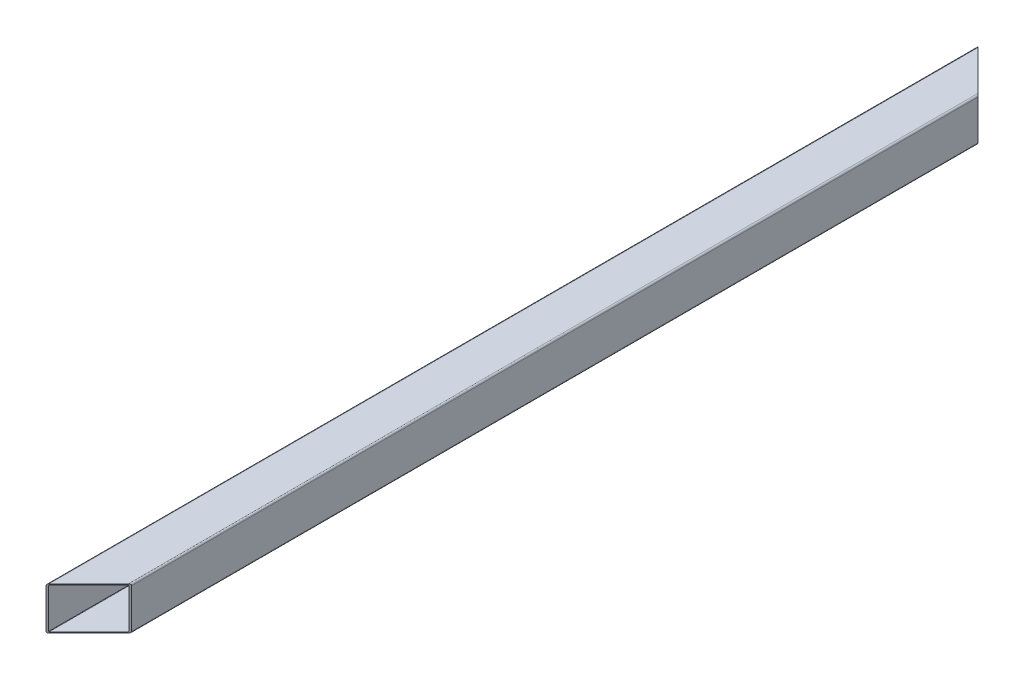
ISO-10303-21;
HEADER;
FILE_DESCRIPTION(('STEP AP214'),'2;1');
FILE_NAME('part.step','',(''),(''),'','','');
FILE_SCHEMA(('AUTOMOTIVE_DESIGN { 1 0 10303 214 1 1 1 1 }'));
ENDSEC;
DATA;
#1=APPLICATION_CONTEXT('core data for automotive mechanical design processes');
#2=APPLICATION_PROTOCOL_DEFINITION('international standard','automotive_design',2000,#1);
#3=PRODUCT_CONTEXT('',#1,'mechanical');
#4=PRODUCT('Part','Part','',(#3));
#5=PRODUCT_RELATED_PRODUCT_CATEGORY('part','',(#4));
#6=PRODUCT_DEFINITION_FORMATION('','',#4);
#7=PRODUCT_DEFINITION_CONTEXT('part definition',#1,'design');
#8=PRODUCT_DEFINITION('design','',#6,#7);
#9=PRODUCT_DEFINITION_SHAPE('','',#8);
#10=(LENGTH_UNIT() NAMED_UNIT(*) SI_UNIT(.MILLI.,.METRE.));
#11=(NAMED_UNIT(*) PLANE_ANGLE_UNIT() SI_UNIT($,.RADIAN.));
#12=(NAMED_UNIT(*) SI_UNIT($,.STERADIAN.) SOLID_ANGLE_UNIT());
#13=UNCERTAINTY_MEASURE_WITH_UNIT(LENGTH_MEASURE(1.E-05),#10,'distance_accuracy_value','');
#14=(GEOMETRIC_REPRESENTATION_CONTEXT(3) GLOBAL_UNCERTAINTY_ASSIGNED_CONTEXT((#13)) GLOBAL_UNIT_ASSIGNED_CONTEXT((#10,
#11,#12)) REPRESENTATION_CONTEXT('',''));
#15=CARTESIAN_POINT('',(0.,0.,0.));
#16=DIRECTION('',(0.,0.,1.));
#17=DIRECTION('',(1.,0.,0.));
#18=AXIS2_PLACEMENT_3D('',#15,#16,#17);
#19=CARTESIAN_POINT('',(-18.5,18.5,-870.));
#20=DIRECTION('',(0.,0.,1.));
#21=DIRECTION('',(1.,0.,0.));
#22=AXIS2_PLACEMENT_3D('',#19,#20,#21);
#23=CYLINDRICAL_SURFACE('',#22,1.5);
#24=DIRECTION('',(0.,0.,1.));
#25=VECTOR('',#24,1.);
#26=CARTESIAN_POINT('',(-20.,18.5,-870.));
#27=LINE('',#26,#25);
#28=CARTESIAN_POINT('',(-20.,18.4999999999999,-870.));
#29=VERTEX_POINT('',#28);
#30=CARTESIAN_POINT('',(-20.,18.5,0.));
#31=VERTEX_POINT('',#30);
#32=EDGE_CURVE('E203',#29,#31,#27,.T.);
#33=ORIENTED_EDGE('',*,*,#32,.T.);
#34=CARTESIAN_POINT('',(-18.5,18.5,-1.50000000000017));
#35=DIRECTION('',(-0.707106781186556,0.,-0.707106781186539));
#36=DIRECTION('',(-0.707106781186539,0.,0.707106781186556));
#37=AXIS2_PLACEMENT_3D('',#34,#35,#36);
#38=ELLIPSE('',#37,2.12132034355966,1.5);
#39=CARTESIAN_POINT('',(-18.5,20.,-1.50000000000017));
#40=VERTEX_POINT('',#39);
#41=EDGE_CURVE('E183',#31,#40,#38,.T.);
#42=ORIENTED_EDGE('',*,*,#41,.T.);
#43=DIRECTION('',(0.,0.,1.));
#44=VECTOR('',#43,1.);
#45=CARTESIAN_POINT('',(-18.5,20.,-870.));
#46=LINE('',#45,#44);
#47=CARTESIAN_POINT('',(-18.5,20.,-868.5));
#48=VERTEX_POINT('',#47);
#49=EDGE_CURVE('E12',#48,#40,#46,.T.);
#50=ORIENTED_EDGE('',*,*,#49,.F.);
#51=CARTESIAN_POINT('',(-18.5,18.5,-868.5));
#52=DIRECTION('',(-0.707106781186539,0.,0.707106781186556));
#53=DIRECTION('',(0.707106781186556,0.,0.707106781186539));
#54=AXIS2_PLACEMENT_3D('',#51,#52,#53);
#55=ELLIPSE('',#54,2.12132034355961,1.5);
#56=EDGE_CURVE('E189',#48,#29,#55,.T.);
#57=ORIENTED_EDGE('',*,*,#56,.T.);
#58=EDGE_LOOP('',(#33,#42,#50,#57));
#59=FACE_BOUND('',#58,.T.);
#60=ADVANCED_FACE('F63',(#59),#23,.T.);
#61=CARTESIAN_POINT('',(-18.5,20.,-870.));
#62=DIRECTION('',(0.,-1.,0.));
#63=DIRECTION('',(0.,0.,-1.));
#64=AXIS2_PLACEMENT_3D('',#61,#62,#63);
#65=PLANE('',#64);
#66=ORIENTED_EDGE('',*,*,#49,.T.);
#67=DIRECTION('',(0.707106781186539,0.,-0.707106781186556));
#68=VECTOR('',#67,1.);
#69=CARTESIAN_POINT('',(415.75,20.,-435.750000000011));
#70=LINE('',#69,#68);
#71=CARTESIAN_POINT('',(18.5,20.,-38.500000000001));
#72=VERTEX_POINT('',#71);
#73=EDGE_CURVE('E269',#40,#72,#70,.T.);
#74=ORIENTED_EDGE('',*,*,#73,.T.);
#75=DIRECTION('',(0.,0.,1.));
#76=VECTOR('',#75,1.);
#77=CARTESIAN_POINT('',(18.5,20.,-870.));
#78=LINE('',#77,#76);
#79=CARTESIAN_POINT('',(18.5,20.,-831.500000000001));
#80=VERTEX_POINT('',#79);
#81=EDGE_CURVE('E72',#80,#72,#78,.T.);
#82=ORIENTED_EDGE('',*,*,#81,.F.);
#83=DIRECTION('',(-0.707106781186556,0.,-0.707106781186539));
#84=VECTOR('',#83,1.);
#85=CARTESIAN_POINT('',(-19.25,20.,-869.25));
#86=LINE('',#85,#84);
#87=EDGE_CURVE('E300',#80,#48,#86,.T.);
#88=ORIENTED_EDGE('',*,*,#87,.T.);
#89=EDGE_LOOP('',(#66,#74,#82,#88));
#90=FACE_BOUND('',#89,.T.);
#91=ADVANCED_FACE('F310',(#90),#65,.F.);
#92=CARTESIAN_POINT('',(18.5,18.5,-870.));
#93=DIRECTION('',(0.,0.,1.));
#94=DIRECTION('',(1.,0.,0.));
#95=AXIS2_PLACEMENT_3D('',#92,#93,#94);
#96=CYLINDRICAL_SURFACE('',#95,1.5);
#97=ORIENTED_EDGE('',*,*,#81,.T.);
#98=CARTESIAN_POINT('',(18.5,18.5,-38.500000000001));
#99=DIRECTION('',(-0.707106781186556,0.,-0.707106781186539));
#100=DIRECTION('',(-0.707106781186539,0.,0.707106781186556));
#101=AXIS2_PLACEMENT_3D('',#98,#99,#100);
#102=ELLIPSE('',#101,2.12132034355966,1.5);
#103=CARTESIAN_POINT('',(20.,18.5,-40.000000000001));
#104=VERTEX_POINT('',#103);
#105=EDGE_CURVE('E266',#72,#104,#102,.T.);
#106=ORIENTED_EDGE('',*,*,#105,.T.);
#107=DIRECTION('',(0.,0.,1.));
#108=VECTOR('',#107,1.);
#109=CARTESIAN_POINT('',(20.,18.5,-870.));
#110=LINE('',#109,#108);
#111=CARTESIAN_POINT('',(20.,18.5,-830.000000000001));
#112=VERTEX_POINT('',#111);
#113=EDGE_CURVE('E214',#112,#104,#110,.T.);
#114=ORIENTED_EDGE('',*,*,#113,.F.);
#115=CARTESIAN_POINT('',(18.5,18.5,-831.500000000001));
#116=DIRECTION('',(-0.707106781186539,0.,0.707106781186556));
#117=DIRECTION('',(0.707106781186556,0.,0.707106781186539));
#118=AXIS2_PLACEMENT_3D('',#115,#116,#117);
#119=ELLIPSE('',#118,2.12132034355961,1.5);
#120=EDGE_CURVE('E297',#112,#80,#119,.T.);
#121=ORIENTED_EDGE('',*,*,#120,.T.);
#122=EDGE_LOOP('',(#97,#106,#114,#121));
#123=FACE_BOUND('',#122,.T.);
#124=ADVANCED_FACE('F314',(#123),#96,.T.);
#125=CARTESIAN_POINT('',(20.,-18.5,-870.));
#126=DIRECTION('',(-1.,0.,0.));
#127=DIRECTION('',(0.,0.,1.));
#128=AXIS2_PLACEMENT_3D('',#125,#126,#127);
#129=PLANE('',#128);
#130=ORIENTED_EDGE('',*,*,#113,.T.);
#131=DIRECTION('',(0.,-1.,0.));
#132=VECTOR('',#131,1.);
#133=CARTESIAN_POINT('',(20.,-18.5,-40.000000000001));
#134=LINE('',#133,#132);
#135=CARTESIAN_POINT('',(20.,-18.5,-40.000000000001));
#136=VERTEX_POINT('',#135);
#137=EDGE_CURVE('E263',#104,#136,#134,.T.);
#138=ORIENTED_EDGE('',*,*,#137,.T.);
#139=DIRECTION('',(0.,0.,1.));
#140=VECTOR('',#139,1.);
#141=CARTESIAN_POINT('',(20.,-18.5,-870.));
#142=LINE('',#141,#140);
#143=CARTESIAN_POINT('',(20.,-18.5,-830.000000000001));
#144=VERTEX_POINT('',#143);
#145=EDGE_CURVE('E211',#144,#136,#142,.T.);
#146=ORIENTED_EDGE('',*,*,#145,.F.);
#147=DIRECTION('',(0.,1.,0.));
#148=VECTOR('',#147,1.);
#149=CARTESIAN_POINT('',(20.,-18.5,-830.000000000001));
#150=LINE('',#149,#148);
#151=EDGE_CURVE('E294',#144,#112,#150,.T.);
#152=ORIENTED_EDGE('',*,*,#151,.T.);
#153=EDGE_LOOP('',(#130,#138,#146,#152));
#154=FACE_BOUND('',#153,.T.);
#155=ADVANCED_FACE('F316',(#154),#129,.F.);
#156=CARTESIAN_POINT('',(18.5,-18.5,-870.));
#157=DIRECTION('',(0.,0.,1.));
#158=DIRECTION('',(1.,0.,0.));
#159=AXIS2_PLACEMENT_3D('',#156,#157,#158);
#160=CYLINDRICAL_SURFACE('',#159,1.5);
#161=ORIENTED_EDGE('',*,*,#145,.T.);
#162=CARTESIAN_POINT('',(18.5,-18.5,-38.500000000001));
#163=DIRECTION('',(-0.707106781186556,0.,-0.707106781186539));
#164=DIRECTION('',(-0.707106781186539,0.,0.707106781186556));
#165=AXIS2_PLACEMENT_3D('',#162,#163,#164);
#166=ELLIPSE('',#165,2.12132034355967,1.5);
#167=CARTESIAN_POINT('',(18.5,-20.,-38.500000000001));
#168=VERTEX_POINT('',#167);
#169=EDGE_CURVE('E260',#136,#168,#166,.T.);
#170=ORIENTED_EDGE('',*,*,#169,.T.);
#171=DIRECTION('',(0.,0.,1.));
#172=VECTOR('',#171,1.);
#173=CARTESIAN_POINT('',(18.5,-20.,-870.));
#174=LINE('',#173,#172);
#175=CARTESIAN_POINT('',(18.5,-20.,-831.500000000001));
#176=VERTEX_POINT('',#175);
#177=EDGE_CURVE('E205',#176,#168,#174,.T.);
#178=ORIENTED_EDGE('',*,*,#177,.F.);
#179=CARTESIAN_POINT('',(18.5,-18.5,-831.500000000001));
#180=DIRECTION('',(-0.707106781186539,0.,0.707106781186556));
#181=DIRECTION('',(0.707106781186556,0.,0.707106781186539));
#182=AXIS2_PLACEMENT_3D('',#179,#180,#181);
#183=ELLIPSE('',#182,2.12132034355962,1.5);
#184=EDGE_CURVE('E291',#176,#144,#183,.T.);
#185=ORIENTED_EDGE('',*,*,#184,.T.);
#186=EDGE_LOOP('',(#161,#170,#178,#185));
#187=FACE_BOUND('',#186,.T.);
#188=ADVANCED_FACE('F320',(#187),#160,.T.);
#189=CARTESIAN_POINT('',(18.5,-20.,-870.));
#190=DIRECTION('',(0.,1.,0.));
#191=DIRECTION('',(0.,0.,1.));
#192=AXIS2_PLACEMENT_3D('',#189,#190,#191);
#193=PLANE('',#192);
#194=ORIENTED_EDGE('',*,*,#177,.T.);
#195=DIRECTION('',(-0.707106781186539,0.,0.707106781186556));
#196=VECTOR('',#195,1.);
#197=CARTESIAN_POINT('',(434.25,-20.,-454.25000000001));
#198=LINE('',#197,#196);
#199=CARTESIAN_POINT('',(-18.5,-20.,-1.50000000000017));
#200=VERTEX_POINT('',#199);
#201=EDGE_CURVE('E200',#168,#200,#198,.T.);
#202=ORIENTED_EDGE('',*,*,#201,.T.);
#203=DIRECTION('',(0.,0.,1.));
#204=VECTOR('',#203,1.);
#205=CARTESIAN_POINT('',(-18.5,-20.,-870.));
#206=LINE('',#205,#204);
#207=CARTESIAN_POINT('',(-18.5,-20.,-868.5));
#208=VERTEX_POINT('',#207);
#209=EDGE_CURVE('E199',#208,#200,#206,.T.);
#210=ORIENTED_EDGE('',*,*,#209,.F.);
#211=DIRECTION('',(0.707106781186556,0.,0.707106781186539));
#212=VECTOR('',#211,1.);
#213=CARTESIAN_POINT('',(-0.749999999999529,-20.,-850.75));
#214=LINE('',#213,#212);
#215=EDGE_CURVE('E288',#208,#176,#214,.T.);
#216=ORIENTED_EDGE('',*,*,#215,.T.);
#217=EDGE_LOOP('',(#194,#202,#210,#216));
#218=FACE_BOUND('',#217,.T.);
#219=ADVANCED_FACE('F322',(#218),#193,.F.);
#220=CARTESIAN_POINT('',(-18.5,-18.5,-870.));
#221=DIRECTION('',(0.,0.,1.));
#222=DIRECTION('',(1.,0.,0.));
#223=AXIS2_PLACEMENT_3D('',#220,#221,#222);
#224=CYLINDRICAL_SURFACE('',#223,1.5);
#225=ORIENTED_EDGE('',*,*,#209,.T.);
#226=CARTESIAN_POINT('',(-18.5,-18.5,-1.50000000000017));
#227=DIRECTION('',(-0.707106781186556,0.,-0.707106781186539));
#228=DIRECTION('',(-0.707106781186539,0.,0.707106781186556));
#229=AXIS2_PLACEMENT_3D('',#226,#227,#228);
#230=ELLIPSE('',#229,2.12132034355967,1.5);
#231=CARTESIAN_POINT('',(-20.,-18.5000000000001,0.));
#232=VERTEX_POINT('',#231);
#233=EDGE_CURVE('E180',#200,#232,#230,.T.);
#234=ORIENTED_EDGE('',*,*,#233,.T.);
#235=DIRECTION('',(0.,0.,1.));
#236=VECTOR('',#235,1.);
#237=CARTESIAN_POINT('',(-20.,-18.5,-870.));
#238=LINE('',#237,#236);
#239=CARTESIAN_POINT('',(-20.,-18.5,-870.));
#240=VERTEX_POINT('',#239);
#241=EDGE_CURVE('E196',#240,#232,#238,.T.);
#242=ORIENTED_EDGE('',*,*,#241,.F.);
#243=CARTESIAN_POINT('',(-18.5,-18.5,-868.5));
#244=DIRECTION('',(-0.707106781186539,0.,0.707106781186556));
#245=DIRECTION('',(0.707106781186556,0.,0.707106781186539));
#246=AXIS2_PLACEMENT_3D('',#243,#244,#245);
#247=ELLIPSE('',#246,2.12132034355962,1.5);
#248=EDGE_CURVE('E286',#240,#208,#247,.T.);
#249=ORIENTED_EDGE('',*,*,#248,.T.);
#250=EDGE_LOOP('',(#225,#234,#242,#249));
#251=FACE_BOUND('',#250,.T.);
#252=ADVANCED_FACE('F194',(#251),#224,.T.);
#253=CARTESIAN_POINT('',(18.5,18.5,-870.));
#254=DIRECTION('',(0.,0.,1.));
#255=DIRECTION('',(1.,0.,0.));
#256=AXIS2_PLACEMENT_3D('',#253,#254,#255);
#257=CYLINDRICAL_SURFACE('',#256,0.3);
#258=CARTESIAN_POINT('',(18.5,18.5,-38.500000000001));
#259=DIRECTION('',(-0.707106781186556,0.,-0.707106781186539));
#260=DIRECTION('',(-0.707106781186539,0.,0.707106781186556));
#261=AXIS2_PLACEMENT_3D('',#258,#259,#260);
#262=ELLIPSE('',#261,0.424264068711934,0.3);
#263=CARTESIAN_POINT('',(18.5,18.8,-38.5000000000011));
#264=VERTEX_POINT('',#263);
#265=CARTESIAN_POINT('',(18.8,18.5,-38.8000000000012));
#266=VERTEX_POINT('',#265);
#267=EDGE_CURVE('E80',#264,#266,#262,.T.);
#268=ORIENTED_EDGE('',*,*,#267,.F.);
#269=DIRECTION('',(0.,0.,1.));
#270=VECTOR('',#269,1.);
#271=CARTESIAN_POINT('',(18.5,18.8,-870.));
#272=LINE('',#271,#270);
#273=CARTESIAN_POINT('',(18.5,18.8,-831.500000000001));
#274=VERTEX_POINT('',#273);
#275=EDGE_CURVE('E67',#274,#264,#272,.T.);
#276=ORIENTED_EDGE('',*,*,#275,.F.);
#277=CARTESIAN_POINT('',(18.5,18.5,-831.500000000001));
#278=DIRECTION('',(-0.707106781186539,0.,0.707106781186556));
#279=DIRECTION('',(0.707106781186556,0.,0.707106781186539));
#280=AXIS2_PLACEMENT_3D('',#277,#278,#279);
#281=ELLIPSE('',#280,0.424264068711923,0.3);
#282=CARTESIAN_POINT('',(18.8,18.5,-831.200000000001));
#283=VERTEX_POINT('',#282);
#284=EDGE_CURVE('E252',#283,#274,#281,.T.);
#285=ORIENTED_EDGE('',*,*,#284,.F.);
#286=DIRECTION('',(0.,0.,1.));
#287=VECTOR('',#286,1.);
#288=CARTESIAN_POINT('',(18.8,18.5,-870.));
#289=LINE('',#288,#287);
#290=EDGE_CURVE('E219',#283,#266,#289,.T.);
#291=ORIENTED_EDGE('',*,*,#290,.T.);
#292=EDGE_LOOP('',(#268,#276,#285,#291));
#293=FACE_BOUND('',#292,.T.);
#294=ADVANCED_FACE('F65',(#293),#257,.F.);
#295=CARTESIAN_POINT('',(-18.5,18.8,-870.));
#296=DIRECTION('',(0.,-1.,0.));
#297=DIRECTION('',(0.,0.,-1.));
#298=AXIS2_PLACEMENT_3D('',#295,#296,#297);
#299=PLANE('',#298);
#300=DIRECTION('',(0.707106781186539,0.,-0.707106781186556));
#301=VECTOR('',#300,1.);
#302=CARTESIAN_POINT('',(415.75,18.8,-435.750000000011));
#303=LINE('',#302,#301);
#304=CARTESIAN_POINT('',(-18.5,18.8,-1.50000000000017));
#305=VERTEX_POINT('',#304);
#306=EDGE_CURVE('E248',#305,#264,#303,.T.);
#307=ORIENTED_EDGE('',*,*,#306,.F.);
#308=DIRECTION('',(0.,0.,1.));
#309=VECTOR('',#308,1.);
#310=CARTESIAN_POINT('',(-18.5,18.8,-870.));
#311=LINE('',#310,#309);
#312=CARTESIAN_POINT('',(-18.5,18.8,-868.5));
#313=VERTEX_POINT('',#312);
#314=EDGE_CURVE('E236',#313,#305,#311,.T.);
#315=ORIENTED_EDGE('',*,*,#314,.F.);
#316=DIRECTION('',(-0.707106781186556,0.,-0.707106781186539));
#317=VECTOR('',#316,1.);
#318=CARTESIAN_POINT('',(-19.25,18.8,-869.25));
#319=LINE('',#318,#317);
#320=EDGE_CURVE('E249',#274,#313,#319,.T.);
#321=ORIENTED_EDGE('',*,*,#320,.F.);
#322=ORIENTED_EDGE('',*,*,#275,.T.);
#323=EDGE_LOOP('',(#307,#315,#321,#322));
#324=FACE_BOUND('',#323,.T.);
#325=ADVANCED_FACE('F247',(#324),#299,.T.);
#326=CARTESIAN_POINT('',(-18.5,18.5,-870.));
#327=DIRECTION('',(0.,0.,1.));
#328=DIRECTION('',(1.,0.,0.));
#329=AXIS2_PLACEMENT_3D('',#326,#327,#328);
#330=CYLINDRICAL_SURFACE('',#329,0.3);
#331=CARTESIAN_POINT('',(-18.5,18.5,-1.50000000000017));
#332=DIRECTION('',(-0.707106781186556,0.,-0.707106781186539));
#333=DIRECTION('',(-0.707106781186539,0.,0.707106781186556));
#334=AXIS2_PLACEMENT_3D('',#331,#332,#333);
#335=ELLIPSE('',#334,0.424264068711934,0.3);
#336=CARTESIAN_POINT('',(-18.8,18.5,-1.20000000000009));
#337=VERTEX_POINT('',#336);
#338=EDGE_CURVE('E255',#337,#305,#335,.T.);
#339=ORIENTED_EDGE('',*,*,#338,.F.);
#340=DIRECTION('',(0.,0.,1.));
#341=VECTOR('',#340,1.);
#342=CARTESIAN_POINT('',(-18.8,18.5,-870.));
#343=LINE('',#342,#341);
#344=CARTESIAN_POINT('',(-18.8,18.5,-868.8));
#345=VERTEX_POINT('',#344);
#346=EDGE_CURVE('E234',#345,#337,#343,.T.);
#347=ORIENTED_EDGE('',*,*,#346,.F.);
#348=CARTESIAN_POINT('',(-18.5,18.5,-868.5));
#349=DIRECTION('',(-0.707106781186539,0.,0.707106781186556));
#350=DIRECTION('',(0.707106781186556,0.,0.707106781186539));
#351=AXIS2_PLACEMENT_3D('',#348,#349,#350);
#352=ELLIPSE('',#351,0.424264068711923,0.3);
#353=EDGE_CURVE('E282',#313,#345,#352,.T.);
#354=ORIENTED_EDGE('',*,*,#353,.F.);
#355=ORIENTED_EDGE('',*,*,#314,.T.);
#356=EDGE_LOOP('',(#339,#347,#354,#355));
#357=FACE_BOUND('',#356,.T.);
#358=ADVANCED_FACE('F358',(#357),#330,.F.);
#359=CARTESIAN_POINT('',(-18.8,18.5,-870.));
#360=DIRECTION('',(1.,0.,0.));
#361=DIRECTION('',(0.,0.,-1.));
#362=AXIS2_PLACEMENT_3D('',#359,#360,#361);
#363=PLANE('',#362);
#364=DIRECTION('',(0.,1.,0.));
#365=VECTOR('',#364,1.);
#366=CARTESIAN_POINT('',(-18.8,18.5,-1.20000000000009));
#367=LINE('',#366,#365);
#368=CARTESIAN_POINT('',(-18.8,-18.5,-1.20000000000009));
#369=VERTEX_POINT('',#368);
#370=EDGE_CURVE('E515',#369,#337,#367,.T.);
#371=ORIENTED_EDGE('',*,*,#370,.F.);
#372=DIRECTION('',(0.,0.,1.));
#373=VECTOR('',#372,1.);
#374=CARTESIAN_POINT('',(-18.8,-18.5,-870.));
#375=LINE('',#374,#373);
#376=CARTESIAN_POINT('',(-18.8,-18.5,-868.8));
#377=VERTEX_POINT('',#376);
#378=EDGE_CURVE('E231',#377,#369,#375,.T.);
#379=ORIENTED_EDGE('',*,*,#378,.F.);
#380=DIRECTION('',(0.,-1.,0.));
#381=VECTOR('',#380,1.);
#382=CARTESIAN_POINT('',(-18.8,18.5,-868.8));
#383=LINE('',#382,#381);
#384=EDGE_CURVE('E280',#345,#377,#383,.T.);
#385=ORIENTED_EDGE('',*,*,#384,.F.);
#386=ORIENTED_EDGE('',*,*,#346,.T.);
#387=EDGE_LOOP('',(#371,#379,#385,#386));
#388=FACE_BOUND('',#387,.T.);
#389=ADVANCED_FACE('F354',(#388),#363,.T.);
#390=CARTESIAN_POINT('',(-18.5,-18.5,-870.));
#391=DIRECTION('',(0.,0.,1.));
#392=DIRECTION('',(1.,0.,0.));
#393=AXIS2_PLACEMENT_3D('',#390,#391,#392);
#394=CYLINDRICAL_SURFACE('',#393,0.300000000000005);
#395=CARTESIAN_POINT('',(-18.5,-18.5,-1.50000000000017));
#396=DIRECTION('',(-0.707106781186556,0.,-0.707106781186539));
#397=DIRECTION('',(-0.707106781186539,0.,0.707106781186556));
#398=AXIS2_PLACEMENT_3D('',#395,#396,#397);
#399=ELLIPSE('',#398,0.424264068711941,0.300000000000005);
#400=CARTESIAN_POINT('',(-18.5,-18.8,-1.50000000000011));
#401=VERTEX_POINT('',#400);
#402=EDGE_CURVE('E510',#401,#369,#399,.T.);
#403=ORIENTED_EDGE('',*,*,#402,.F.);
#404=DIRECTION('',(0.,0.,1.));
#405=VECTOR('',#404,1.);
#406=CARTESIAN_POINT('',(-18.5,-18.8,-870.));
#407=LINE('',#406,#405);
#408=CARTESIAN_POINT('',(-18.5,-18.8,-868.5));
#409=VERTEX_POINT('',#408);
#410=EDGE_CURVE('E228',#409,#401,#407,.T.);
#411=ORIENTED_EDGE('',*,*,#410,.F.);
#412=CARTESIAN_POINT('',(-18.5,-18.5,-868.5));
#413=DIRECTION('',(-0.707106781186539,0.,0.707106781186556));
#414=DIRECTION('',(0.707106781186556,0.,0.707106781186539));
#415=AXIS2_PLACEMENT_3D('',#412,#413,#414);
#416=ELLIPSE('',#415,0.424264068711931,0.300000000000005);
#417=EDGE_CURVE('E278',#377,#409,#416,.T.);
#418=ORIENTED_EDGE('',*,*,#417,.F.);
#419=ORIENTED_EDGE('',*,*,#378,.T.);
#420=EDGE_LOOP('',(#403,#411,#418,#419));
#421=FACE_BOUND('',#420,.T.);
#422=ADVANCED_FACE('F350',(#421),#394,.F.);
#423=CARTESIAN_POINT('',(18.5,-18.8,-870.));
#424=DIRECTION('',(0.,1.,0.));
#425=DIRECTION('',(0.,0.,1.));
#426=AXIS2_PLACEMENT_3D('',#423,#424,#425);
#427=PLANE('',#426);
#428=DIRECTION('',(-0.707106781186539,0.,0.707106781186556));
#429=VECTOR('',#428,1.);
#430=CARTESIAN_POINT('',(434.25,-18.8,-454.25000000001));
#431=LINE('',#430,#429);
#432=CARTESIAN_POINT('',(18.5,-18.8,-38.500000000001));
#433=VERTEX_POINT('',#432);
#434=EDGE_CURVE('E507',#433,#401,#431,.T.);
#435=ORIENTED_EDGE('',*,*,#434,.F.);
#436=DIRECTION('',(0.,0.,1.));
#437=VECTOR('',#436,1.);
#438=CARTESIAN_POINT('',(18.5,-18.8,-870.));
#439=LINE('',#438,#437);
#440=CARTESIAN_POINT('',(18.5,-18.8,-831.500000000001));
#441=VERTEX_POINT('',#440);
#442=EDGE_CURVE('E225',#441,#433,#439,.T.);
#443=ORIENTED_EDGE('',*,*,#442,.F.);
#444=DIRECTION('',(0.707106781186556,0.,0.707106781186539));
#445=VECTOR('',#444,1.);
#446=CARTESIAN_POINT('',(-0.749999999999529,-18.8,-850.75));
#447=LINE('',#446,#445);
#448=EDGE_CURVE('E276',#409,#441,#447,.T.);
#449=ORIENTED_EDGE('',*,*,#448,.F.);
#450=ORIENTED_EDGE('',*,*,#410,.T.);
#451=EDGE_LOOP('',(#435,#443,#449,#450));
#452=FACE_BOUND('',#451,.T.);
#453=ADVANCED_FACE('F346',(#452),#427,.T.);
#454=CARTESIAN_POINT('',(18.5,-18.5,-870.));
#455=DIRECTION('',(0.,0.,1.));
#456=DIRECTION('',(1.,0.,0.));
#457=AXIS2_PLACEMENT_3D('',#454,#455,#456);
#458=CYLINDRICAL_SURFACE('',#457,0.300000000000003);
#459=CARTESIAN_POINT('',(18.5,-18.5,-38.500000000001));
#460=DIRECTION('',(-0.707106781186556,0.,-0.707106781186539));
#461=DIRECTION('',(-0.707106781186539,0.,0.707106781186556));
#462=AXIS2_PLACEMENT_3D('',#459,#460,#461);
#463=ELLIPSE('',#462,0.424264068711938,0.300000000000003);
#464=CARTESIAN_POINT('',(18.8,-18.5,-38.8000000000009));
#465=VERTEX_POINT('',#464);
#466=EDGE_CURVE('E505',#465,#433,#463,.T.);
#467=ORIENTED_EDGE('',*,*,#466,.F.);
#468=DIRECTION('',(0.,0.,1.));
#469=VECTOR('',#468,1.);
#470=CARTESIAN_POINT('',(18.8,-18.5,-870.));
#471=LINE('',#470,#469);
#472=CARTESIAN_POINT('',(18.8,-18.5,-831.200000000001));
#473=VERTEX_POINT('',#472);
#474=EDGE_CURVE('E222',#473,#465,#471,.T.);
#475=ORIENTED_EDGE('',*,*,#474,.F.);
#476=CARTESIAN_POINT('',(18.5,-18.5,-831.500000000001));
#477=DIRECTION('',(-0.707106781186539,0.,0.707106781186556));
#478=DIRECTION('',(0.707106781186556,0.,0.707106781186539));
#479=AXIS2_PLACEMENT_3D('',#476,#477,#478);
#480=ELLIPSE('',#479,0.424264068711928,0.300000000000003);
#481=EDGE_CURVE('E88',#441,#473,#480,.T.);
#482=ORIENTED_EDGE('',*,*,#481,.F.);
#483=ORIENTED_EDGE('',*,*,#442,.T.);
#484=EDGE_LOOP('',(#467,#475,#482,#483));
#485=FACE_BOUND('',#484,.T.);
#486=ADVANCED_FACE('F342',(#485),#458,.F.);
#487=CARTESIAN_POINT('',(18.8,-18.5,-870.));
#488=DIRECTION('',(-1.,0.,0.));
#489=DIRECTION('',(0.,0.,1.));
#490=AXIS2_PLACEMENT_3D('',#487,#488,#489);
#491=PLANE('',#490);
#492=DIRECTION('',(0.,-1.,0.));
#493=VECTOR('',#492,1.);
#494=CARTESIAN_POINT('',(18.8,-18.5,-38.8000000000009));
#495=LINE('',#494,#493);
#496=EDGE_CURVE('E508',#266,#465,#495,.T.);
#497=ORIENTED_EDGE('',*,*,#496,.F.);
#498=ORIENTED_EDGE('',*,*,#290,.F.);
#499=DIRECTION('',(0.,1.,0.));
#500=VECTOR('',#499,1.);
#501=CARTESIAN_POINT('',(18.8,-18.5,-831.200000000001));
#502=LINE('',#501,#500);
#503=EDGE_CURVE('E273',#473,#283,#502,.T.);
#504=ORIENTED_EDGE('',*,*,#503,.F.);
#505=ORIENTED_EDGE('',*,*,#474,.T.);
#506=EDGE_LOOP('',(#497,#498,#504,#505));
#507=FACE_BOUND('',#506,.T.);
#508=ADVANCED_FACE('F339',(#507),#491,.T.);
#509=CARTESIAN_POINT('',(-20.,18.5,-870.));
#510=DIRECTION('',(1.,0.,0.));
#511=DIRECTION('',(0.,0.,-1.));
#512=AXIS2_PLACEMENT_3D('',#509,#510,#511);
#513=PLANE('',#512);
#514=DIRECTION('',(0.,1.,0.));
#515=VECTOR('',#514,1.);
#516=CARTESIAN_POINT('',(-20.,18.5,0.));
#517=LINE('',#516,#515);
#518=EDGE_CURVE('E177',#232,#31,#517,.T.);
#519=ORIENTED_EDGE('',*,*,#518,.T.);
#520=ORIENTED_EDGE('',*,*,#32,.F.);
#521=DIRECTION('',(0.,1.,0.));
#522=VECTOR('',#521,1.);
#523=CARTESIAN_POINT('',(-20.,18.5,-870.));
#524=LINE('',#523,#522);
#525=EDGE_CURVE('E188',#240,#29,#524,.T.);
#526=ORIENTED_EDGE('',*,*,#525,.F.);
#527=ORIENTED_EDGE('',*,*,#241,.T.);
#528=EDGE_LOOP('',(#519,#520,#526,#527));
#529=FACE_BOUND('',#528,.T.);
#530=ADVANCED_FACE('F202',(#529),#513,.F.);
#531=CARTESIAN_POINT('',(-20.,-325.,-870.));
#532=DIRECTION('',(-0.707106781186539,0.,0.707106781186556));
#533=DIRECTION('',(0.707106781186556,0.,0.707106781186539));
#534=AXIS2_PLACEMENT_3D('',#531,#532,#533);
#535=PLANE('',#534);
#536=ORIENTED_EDGE('',*,*,#284,.T.);
#537=ORIENTED_EDGE('',*,*,#320,.T.);
#538=ORIENTED_EDGE('',*,*,#353,.T.);
#539=ORIENTED_EDGE('',*,*,#384,.T.);
#540=ORIENTED_EDGE('',*,*,#417,.T.);
#541=ORIENTED_EDGE('',*,*,#448,.T.);
#542=ORIENTED_EDGE('',*,*,#481,.T.);
#543=ORIENTED_EDGE('',*,*,#503,.T.);
#544=EDGE_LOOP('',(#536,#537,#538,#539,#540,#541,#542,#543));
#545=FACE_BOUND('',#544,.T.);
#546=ORIENTED_EDGE('',*,*,#87,.F.);
#547=ORIENTED_EDGE('',*,*,#120,.F.);
#548=ORIENTED_EDGE('',*,*,#151,.F.);
#549=ORIENTED_EDGE('',*,*,#184,.F.);
#550=ORIENTED_EDGE('',*,*,#215,.F.);
#551=ORIENTED_EDGE('',*,*,#248,.F.);
#552=ORIENTED_EDGE('',*,*,#525,.T.);
#553=ORIENTED_EDGE('',*,*,#56,.F.);
#554=EDGE_LOOP('',(#546,#547,#548,#549,#550,#551,#552,#553));
#555=FACE_BOUND('',#554,.T.);
#556=ADVANCED_FACE('F306',(#545,#555),#535,.F.);
#557=CARTESIAN_POINT('',(-20.,-325.,0.));
#558=DIRECTION('',(-0.707106781186556,0.,-0.707106781186539));
#559=DIRECTION('',(-0.707106781186539,0.,0.707106781186556));
#560=AXIS2_PLACEMENT_3D('',#557,#558,#559);
#561=PLANE('',#560);
#562=ORIENTED_EDGE('',*,*,#267,.T.);
#563=ORIENTED_EDGE('',*,*,#496,.T.);
#564=ORIENTED_EDGE('',*,*,#466,.T.);
#565=ORIENTED_EDGE('',*,*,#434,.T.);
#566=ORIENTED_EDGE('',*,*,#402,.T.);
#567=ORIENTED_EDGE('',*,*,#370,.T.);
#568=ORIENTED_EDGE('',*,*,#338,.T.);
#569=ORIENTED_EDGE('',*,*,#306,.T.);
#570=EDGE_LOOP('',(#562,#563,#564,#565,#566,#567,#568,#569));
#571=FACE_BOUND('',#570,.T.);
#572=ORIENTED_EDGE('',*,*,#518,.F.);
#573=ORIENTED_EDGE('',*,*,#233,.F.);
#574=ORIENTED_EDGE('',*,*,#201,.F.);
#575=ORIENTED_EDGE('',*,*,#169,.F.);
#576=ORIENTED_EDGE('',*,*,#137,.F.);
#577=ORIENTED_EDGE('',*,*,#105,.F.);
#578=ORIENTED_EDGE('',*,*,#73,.F.);
#579=ORIENTED_EDGE('',*,*,#41,.F.);
#580=EDGE_LOOP('',(#572,#573,#574,#575,#576,#577,#578,#579));
#581=FACE_BOUND('',#580,.T.);
#582=ADVANCED_FACE('F179',(#571,#581),#561,.F.);
#583=CLOSED_SHELL('',(#60,#91,#124,#155,#188,#219,#252,#294,#325,#358,#389,#422,#453,#486,#508,
#530,#556,#582));
#584=MANIFOLD_SOLID_BREP('B2',#583);
#585=ADVANCED_BREP_SHAPE_REPRESENTATION('',(#18,#584),#14);
#586=SHAPE_DEFINITION_REPRESENTATION(#9,#585);
ENDSEC;
END-ISO-10303-21;
